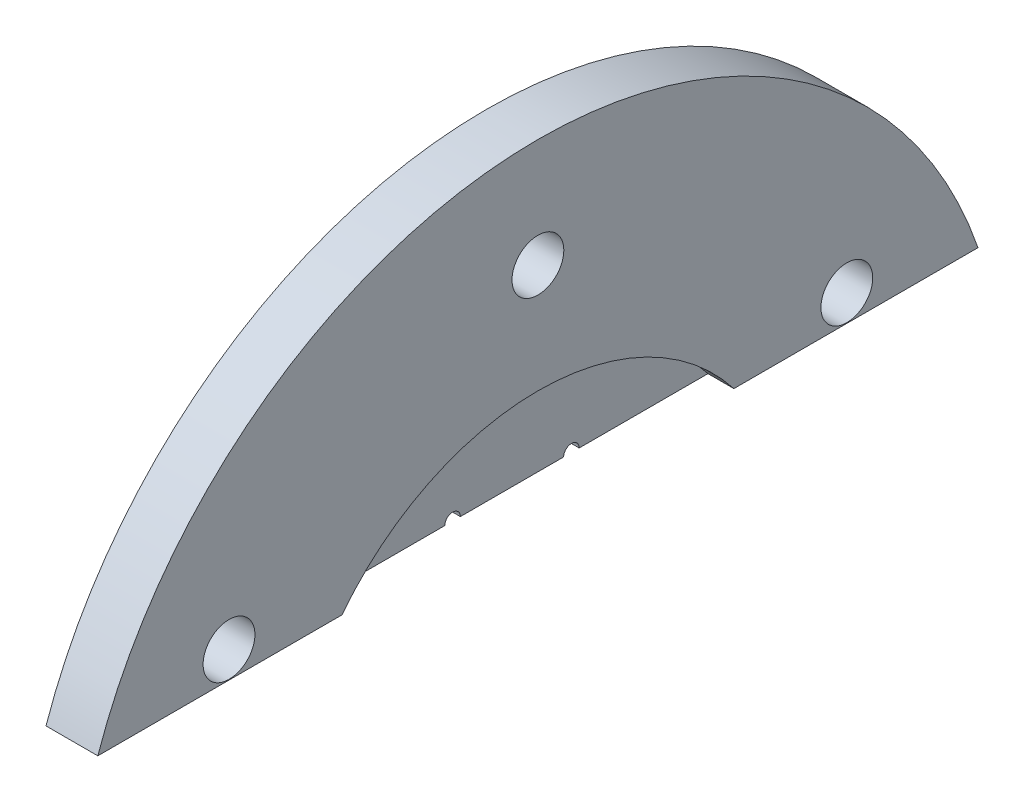
ISO-10303-21;
HEADER;
FILE_DESCRIPTION(('STEP AP214'),'2;1');
FILE_NAME('part.step','',(''),(''),'','','');
FILE_SCHEMA(('AUTOMOTIVE_DESIGN { 1 0 10303 214 1 1 1 1 }'));
ENDSEC;
DATA;
#1=APPLICATION_CONTEXT('core data for automotive mechanical design processes');
#2=APPLICATION_PROTOCOL_DEFINITION('international standard','automotive_design',2000,#1);
#3=PRODUCT_CONTEXT('',#1,'mechanical');
#4=PRODUCT('Part','Part','',(#3));
#5=PRODUCT_RELATED_PRODUCT_CATEGORY('part','',(#4));
#6=PRODUCT_DEFINITION_FORMATION('','',#4);
#7=PRODUCT_DEFINITION_CONTEXT('part definition',#1,'design');
#8=PRODUCT_DEFINITION('design','',#6,#7);
#9=PRODUCT_DEFINITION_SHAPE('','',#8);
#10=(LENGTH_UNIT() NAMED_UNIT(*) SI_UNIT(.MILLI.,.METRE.));
#11=(NAMED_UNIT(*) PLANE_ANGLE_UNIT() SI_UNIT($,.RADIAN.));
#12=(NAMED_UNIT(*) SI_UNIT($,.STERADIAN.) SOLID_ANGLE_UNIT());
#13=UNCERTAINTY_MEASURE_WITH_UNIT(LENGTH_MEASURE(1.E-05),#10,'distance_accuracy_value','');
#14=(GEOMETRIC_REPRESENTATION_CONTEXT(3) GLOBAL_UNCERTAINTY_ASSIGNED_CONTEXT((#13)) GLOBAL_UNIT_ASSIGNED_CONTEXT((#10,
#11,#12)) REPRESENTATION_CONTEXT('',''));
#15=CARTESIAN_POINT('',(0.,0.,0.));
#16=DIRECTION('',(0.,0.,1.));
#17=DIRECTION('',(1.,0.,0.));
#18=AXIS2_PLACEMENT_3D('',#15,#16,#17);
#19=CARTESIAN_POINT('',(-5.,0.,0.));
#20=DIRECTION('',(-1.,0.,0.));
#21=DIRECTION('',(0.,0.,1.));
#22=AXIS2_PLACEMENT_3D('',#19,#20,#21);
#23=PLANE('',#22);
#24=DIRECTION('',(0.,0.,1.));
#25=VECTOR('',#24,1.);
#26=CARTESIAN_POINT('',(-5.,29.2826,0.));
#27=LINE('',#26,#25);
#28=CARTESIAN_POINT('',(-5.,29.2826,-9.96410161513775));
#29=VERTEX_POINT('',#28);
#30=CARTESIAN_POINT('',(-5.,29.2826,-6.96410161513776));
#31=VERTEX_POINT('',#30);
#32=EDGE_CURVE('E302',#29,#31,#27,.T.);
#33=ORIENTED_EDGE('',*,*,#32,.T.);
#34=CARTESIAN_POINT('',(-5.,29.2826,-11.4641016151378));
#35=DIRECTION('',(-1.,0.,0.));
#36=DIRECTION('',(0.,0.,-1.));
#37=AXIS2_PLACEMENT_3D('',#34,#35,#36);
#38=CIRCLE('',#37,4.5);
#39=CARTESIAN_POINT('',(-5.,31.5326,-15.3612159321677));
#40=VERTEX_POINT('',#39);
#41=EDGE_CURVE('E190',#31,#40,#38,.T.);
#42=ORIENTED_EDGE('',*,*,#41,.T.);
#43=DIRECTION('',(0.,-0.866025403784439,-0.5));
#44=VECTOR('',#43,1.);
#45=CARTESIAN_POINT('',(-5.,-2.46309676972451,-34.9886406134571));
#46=LINE('',#45,#44);
#47=CARTESIAN_POINT('',(-5.,29.2826,-16.6602540378444));
#48=VERTEX_POINT('',#47);
#49=EDGE_CURVE('E193',#40,#48,#46,.T.);
#50=ORIENTED_EDGE('',*,*,#49,.T.);
#51=CARTESIAN_POINT('',(-5.,29.2826,-12.9641016151378));
#52=VERTEX_POINT('',#51);
#53=EDGE_CURVE('E161',#48,#52,#27,.T.);
#54=ORIENTED_EDGE('',*,*,#53,.T.);
#55=CARTESIAN_POINT('',(-5.,29.2826,-11.4641016151378));
#56=DIRECTION('',(-1.,0.,0.));
#57=DIRECTION('',(0.,0.,-1.));
#58=AXIS2_PLACEMENT_3D('',#55,#56,#57);
#59=CIRCLE('',#58,1.5);
#60=EDGE_CURVE('E213',#29,#52,#59,.T.);
#61=ORIENTED_EDGE('',*,*,#60,.F.);
#62=EDGE_LOOP('',(#33,#42,#50,#54,#61));
#63=FACE_BOUND('',#62,.T.);
#64=ADVANCED_FACE('F41',(#63),#23,.T.);
#65=CARTESIAN_POINT('',(10.,0.,0.));
#66=DIRECTION('',(-1.,0.,0.));
#67=DIRECTION('',(0.,0.,1.));
#68=AXIS2_PLACEMENT_3D('',#65,#66,#67);
#69=CYLINDRICAL_SURFACE('',#68,47.825);
#70=DIRECTION('',(-1.,0.,0.));
#71=VECTOR('',#70,1.);
#72=CARTESIAN_POINT('',(10.,29.2826,-37.8121668545985));
#73=LINE('',#72,#71);
#74=CARTESIAN_POINT('',(10.,29.2826,-37.8121668545985));
#75=VERTEX_POINT('',#74);
#76=CARTESIAN_POINT('',(5.,29.2826,-37.8121668545985));
#77=VERTEX_POINT('',#76);
#78=EDGE_CURVE('E325',#75,#77,#73,.T.);
#79=ORIENTED_EDGE('',*,*,#78,.F.);
#80=CARTESIAN_POINT('',(10.,0.,0.));
#81=DIRECTION('',(1.,0.,0.));
#82=DIRECTION('',(0.,0.,-1.));
#83=AXIS2_PLACEMENT_3D('',#80,#81,#82);
#84=CIRCLE('',#83,47.825);
#85=CARTESIAN_POINT('',(10.,29.2826,37.8121668545985));
#86=VERTEX_POINT('',#85);
#87=EDGE_CURVE('E223',#75,#86,#84,.T.);
#88=ORIENTED_EDGE('',*,*,#87,.T.);
#89=DIRECTION('',(-1.,0.,0.));
#90=VECTOR('',#89,1.);
#91=CARTESIAN_POINT('',(10.,29.2826,37.8121668545985));
#92=LINE('',#91,#90);
#93=CARTESIAN_POINT('',(5.,29.2826,37.8121668545985));
#94=VERTEX_POINT('',#93);
#95=EDGE_CURVE('E311',#94,#86,#92,.F.);
#96=ORIENTED_EDGE('',*,*,#95,.F.);
#97=CARTESIAN_POINT('',(5.,0.,0.));
#98=DIRECTION('',(-1.,0.,0.));
#99=DIRECTION('',(0.,0.,1.));
#100=AXIS2_PLACEMENT_3D('',#97,#98,#99);
#101=CIRCLE('',#100,47.825);
#102=EDGE_CURVE('E216',#94,#77,#101,.T.);
#103=ORIENTED_EDGE('',*,*,#102,.T.);
#104=EDGE_LOOP('',(#79,#88,#96,#103));
#105=FACE_BOUND('',#104,.T.);
#106=ADVANCED_FACE('F258',(#105),#69,.F.);
#107=CARTESIAN_POINT('',(10.,0.,0.));
#108=DIRECTION('',(1.,0.,0.));
#109=DIRECTION('',(0.,0.,-1.));
#110=AXIS2_PLACEMENT_3D('',#107,#108,#109);
#111=PLANE('',#110);
#112=DIRECTION('',(0.,0.,-1.));
#113=VECTOR('',#112,1.);
#114=CARTESIAN_POINT('',(10.,29.2826,0.));
#115=LINE('',#114,#113);
#116=CARTESIAN_POINT('',(10.,29.2826,-84.9179601865236));
#117=VERTEX_POINT('',#116);
#118=EDGE_CURVE('E350',#75,#117,#115,.T.);
#119=ORIENTED_EDGE('',*,*,#118,.T.);
#120=CARTESIAN_POINT('',(10.,0.,0.));
#121=DIRECTION('',(1.,0.,0.));
#122=DIRECTION('',(0.,0.,-1.));
#123=AXIS2_PLACEMENT_3D('',#120,#121,#122);
#124=CIRCLE('',#123,89.825);
#125=CARTESIAN_POINT('',(10.,29.2826,84.9179601865236));
#126=VERTEX_POINT('',#125);
#127=EDGE_CURVE('E227',#117,#126,#124,.T.);
#128=ORIENTED_EDGE('',*,*,#127,.T.);
#129=EDGE_CURVE('E349',#126,#86,#115,.T.);
#130=ORIENTED_EDGE('',*,*,#129,.T.);
#131=ORIENTED_EDGE('',*,*,#87,.F.);
#132=EDGE_LOOP('',(#119,#128,#130,#131));
#133=FACE_BOUND('',#132,.T.);
#134=CARTESIAN_POINT('',(10.,68.825,0.));
#135=DIRECTION('',(1.,0.,0.));
#136=DIRECTION('',(0.,0.,-1.));
#137=AXIS2_PLACEMENT_3D('',#134,#135,#136);
#138=CIRCLE('',#137,5.);
#139=CARTESIAN_POINT('',(10.,68.825,-5.));
#140=VERTEX_POINT('',#139);
#141=EDGE_CURVE('E234',#140,#140,#138,.T.);
#142=ORIENTED_EDGE('',*,*,#141,.F.);
#143=EDGE_LOOP('',(#142));
#144=FACE_BOUND('',#143,.T.);
#145=CARTESIAN_POINT('',(10.,34.4125,59.604198415464));
#146=DIRECTION('',(1.,0.,0.));
#147=DIRECTION('',(0.,0.,-1.));
#148=AXIS2_PLACEMENT_3D('',#145,#146,#147);
#149=CIRCLE('',#148,5.00000000000001);
#150=CARTESIAN_POINT('',(10.,34.4125,54.604198415464));
#151=VERTEX_POINT('',#150);
#152=EDGE_CURVE('E331',#151,#151,#149,.T.);
#153=ORIENTED_EDGE('',*,*,#152,.F.);
#154=EDGE_LOOP('',(#153));
#155=FACE_BOUND('',#154,.T.);
#156=CARTESIAN_POINT('',(10.,34.4125,-59.604198415464));
#157=DIRECTION('',(1.,0.,0.));
#158=DIRECTION('',(0.,0.,-1.));
#159=AXIS2_PLACEMENT_3D('',#156,#157,#158);
#160=CIRCLE('',#159,5.00000000000001);
#161=CARTESIAN_POINT('',(10.,34.4125,-64.604198415464));
#162=VERTEX_POINT('',#161);
#163=EDGE_CURVE('E334',#162,#162,#160,.T.);
#164=ORIENTED_EDGE('',*,*,#163,.F.);
#165=EDGE_LOOP('',(#164));
#166=FACE_BOUND('',#165,.T.);
#167=ADVANCED_FACE('F265',(#133,#144,#155,#166),#111,.T.);
#168=CARTESIAN_POINT('',(0.,0.,0.));
#169=DIRECTION('',(1.,0.,0.));
#170=DIRECTION('',(0.,0.,-1.));
#171=AXIS2_PLACEMENT_3D('',#168,#169,#170);
#172=PLANE('',#171);
#173=CARTESIAN_POINT('',(0.,68.825,0.));
#174=DIRECTION('',(1.,0.,0.));
#175=DIRECTION('',(0.,0.,-1.));
#176=AXIS2_PLACEMENT_3D('',#173,#174,#175);
#177=CIRCLE('',#176,5.);
#178=CARTESIAN_POINT('',(0.,68.825,-5.));
#179=VERTEX_POINT('',#178);
#180=EDGE_CURVE('E177',#179,#179,#177,.T.);
#181=ORIENTED_EDGE('',*,*,#180,.T.);
#182=EDGE_LOOP('',(#181));
#183=FACE_BOUND('',#182,.T.);
#184=CARTESIAN_POINT('',(0.,34.4125,59.604198415464));
#185=DIRECTION('',(1.,0.,0.));
#186=DIRECTION('',(0.,0.,-1.));
#187=AXIS2_PLACEMENT_3D('',#184,#185,#186);
#188=CIRCLE('',#187,5.00000000000001);
#189=CARTESIAN_POINT('',(0.,34.4125,54.604198415464));
#190=VERTEX_POINT('',#189);
#191=EDGE_CURVE('E183',#190,#190,#188,.T.);
#192=ORIENTED_EDGE('',*,*,#191,.T.);
#193=EDGE_LOOP('',(#192));
#194=FACE_BOUND('',#193,.T.);
#195=CARTESIAN_POINT('',(0.,34.4125,-59.604198415464));
#196=DIRECTION('',(1.,0.,0.));
#197=DIRECTION('',(0.,0.,-1.));
#198=AXIS2_PLACEMENT_3D('',#195,#196,#197);
#199=CIRCLE('',#198,5.00000000000001);
#200=CARTESIAN_POINT('',(0.,34.4125,-64.604198415464));
#201=VERTEX_POINT('',#200);
#202=EDGE_CURVE('E231',#201,#201,#199,.T.);
#203=ORIENTED_EDGE('',*,*,#202,.T.);
#204=EDGE_LOOP('',(#203));
#205=FACE_BOUND('',#204,.T.);
#206=CARTESIAN_POINT('',(0.,0.,0.));
#207=DIRECTION('',(1.,0.,0.));
#208=DIRECTION('',(0.,0.,-1.));
#209=AXIS2_PLACEMENT_3D('',#206,#207,#208);
#210=CIRCLE('',#209,89.825);
#211=CARTESIAN_POINT('',(0.,29.2826,-84.9179601865236));
#212=VERTEX_POINT('',#211);
#213=CARTESIAN_POINT('',(0.,29.2826,84.9179601865236));
#214=VERTEX_POINT('',#213);
#215=EDGE_CURVE('E226',#212,#214,#210,.T.);
#216=ORIENTED_EDGE('',*,*,#215,.F.);
#217=DIRECTION('',(0.,0.,1.));
#218=VECTOR('',#217,1.);
#219=CARTESIAN_POINT('',(0.,29.2826,0.));
#220=LINE('',#219,#218);
#221=CARTESIAN_POINT('',(0.,29.2826,-42.1519271474034));
#222=VERTEX_POINT('',#221);
#223=EDGE_CURVE('E163',#212,#222,#220,.T.);
#224=ORIENTED_EDGE('',*,*,#223,.T.);
#225=CARTESIAN_POINT('',(0.,0.,0.));
#226=DIRECTION('',(-1.,0.,0.));
#227=DIRECTION('',(0.,0.,1.));
#228=AXIS2_PLACEMENT_3D('',#225,#226,#227);
#229=CIRCLE('',#228,51.325);
#230=CARTESIAN_POINT('',(0.,29.2826,42.1519271474034));
#231=VERTEX_POINT('',#230);
#232=EDGE_CURVE('E169',#231,#222,#229,.T.);
#233=ORIENTED_EDGE('',*,*,#232,.F.);
#234=EDGE_CURVE('E152',#231,#214,#220,.T.);
#235=ORIENTED_EDGE('',*,*,#234,.T.);
#236=EDGE_LOOP('',(#216,#224,#233,#235));
#237=FACE_BOUND('',#236,.T.);
#238=ADVANCED_FACE('F175',(#183,#194,#205,#237),#172,.F.);
#239=CARTESIAN_POINT('',(10.,0.,0.));
#240=DIRECTION('',(-1.,0.,0.));
#241=DIRECTION('',(0.,0.,1.));
#242=AXIS2_PLACEMENT_3D('',#239,#240,#241);
#243=CYLINDRICAL_SURFACE('',#242,89.825);
#244=ORIENTED_EDGE('',*,*,#127,.F.);
#245=DIRECTION('',(-1.,0.,0.));
#246=VECTOR('',#245,1.);
#247=CARTESIAN_POINT('',(10.,29.2826,-84.9179601865236));
#248=LINE('',#247,#246);
#249=EDGE_CURVE('E328',#117,#212,#248,.T.);
#250=ORIENTED_EDGE('',*,*,#249,.T.);
#251=ORIENTED_EDGE('',*,*,#215,.T.);
#252=DIRECTION('',(-1.,0.,0.));
#253=VECTOR('',#252,1.);
#254=CARTESIAN_POINT('',(10.,29.2826,84.9179601865236));
#255=LINE('',#254,#253);
#256=EDGE_CURVE('E155',#214,#126,#255,.F.);
#257=ORIENTED_EDGE('',*,*,#256,.T.);
#258=EDGE_LOOP('',(#244,#250,#251,#257));
#259=FACE_BOUND('',#258,.T.);
#260=ADVANCED_FACE('F43',(#259),#243,.T.);
#261=CARTESIAN_POINT('',(5.,0.,0.));
#262=DIRECTION('',(-1.,0.,0.));
#263=DIRECTION('',(0.,0.,1.));
#264=AXIS2_PLACEMENT_3D('',#261,#262,#263);
#265=PLANE('',#264);
#266=ORIENTED_EDGE('',*,*,#102,.F.);
#267=DIRECTION('',(0.,0.,-1.));
#268=VECTOR('',#267,1.);
#269=CARTESIAN_POINT('',(5.,29.2826,0.));
#270=LINE('',#269,#268);
#271=CARTESIAN_POINT('',(5.,29.2826,12.9641016151378));
#272=VERTEX_POINT('',#271);
#273=EDGE_CURVE('E309',#94,#272,#270,.T.);
#274=ORIENTED_EDGE('',*,*,#273,.T.);
#275=CARTESIAN_POINT('',(5.,29.2826,11.4641016151378));
#276=DIRECTION('',(-1.,0.,0.));
#277=DIRECTION('',(0.,0.,1.));
#278=AXIS2_PLACEMENT_3D('',#275,#276,#277);
#279=CIRCLE('',#278,1.5);
#280=CARTESIAN_POINT('',(5.,29.2826,9.96410161513775));
#281=VERTEX_POINT('',#280);
#282=EDGE_CURVE('E212',#281,#272,#279,.F.);
#283=ORIENTED_EDGE('',*,*,#282,.F.);
#284=CARTESIAN_POINT('',(5.,29.2826,-9.96410161513775));
#285=VERTEX_POINT('',#284);
#286=EDGE_CURVE('E314',#281,#285,#270,.T.);
#287=ORIENTED_EDGE('',*,*,#286,.T.);
#288=CARTESIAN_POINT('',(5.,29.2826,-11.4641016151378));
#289=DIRECTION('',(-1.,0.,0.));
#290=DIRECTION('',(0.,0.,1.));
#291=AXIS2_PLACEMENT_3D('',#288,#289,#290);
#292=CIRCLE('',#291,1.5);
#293=CARTESIAN_POINT('',(5.,29.2826,-12.9641016151378));
#294=VERTEX_POINT('',#293);
#295=EDGE_CURVE('E202',#294,#285,#292,.F.);
#296=ORIENTED_EDGE('',*,*,#295,.F.);
#297=EDGE_CURVE('E313',#294,#77,#270,.T.);
#298=ORIENTED_EDGE('',*,*,#297,.T.);
#299=EDGE_LOOP('',(#266,#274,#283,#287,#296,#298));
#300=FACE_BOUND('',#299,.T.);
#301=ADVANCED_FACE('F273',(#300),#265,.F.);
#302=CARTESIAN_POINT('',(-5.,29.2826,12.9641016151378));
#303=VERTEX_POINT('',#302);
#304=CARTESIAN_POINT('',(-5.,29.2826,16.6602540378444));
#305=VERTEX_POINT('',#304);
#306=EDGE_CURVE('E284',#303,#305,#27,.T.);
#307=ORIENTED_EDGE('',*,*,#306,.T.);
#308=DIRECTION('',(0.,0.866025403784438,-0.5));
#309=VECTOR('',#308,1.);
#310=CARTESIAN_POINT('',(-5.,31.5326,15.3612159321677));
#311=LINE('',#310,#309);
#312=CARTESIAN_POINT('',(-5.,31.5326,15.3612159321677));
#313=VERTEX_POINT('',#312);
#314=EDGE_CURVE('E196',#305,#313,#311,.T.);
#315=ORIENTED_EDGE('',*,*,#314,.T.);
#316=CARTESIAN_POINT('',(-5.,29.2826,11.4641016151378));
#317=DIRECTION('',(-1.,0.,0.));
#318=DIRECTION('',(0.,0.,-1.));
#319=AXIS2_PLACEMENT_3D('',#316,#317,#318);
#320=CIRCLE('',#319,4.5);
#321=CARTESIAN_POINT('',(-5.,29.2826,6.96410161513775));
#322=VERTEX_POINT('',#321);
#323=EDGE_CURVE('E187',#313,#322,#320,.T.);
#324=ORIENTED_EDGE('',*,*,#323,.T.);
#325=CARTESIAN_POINT('',(-5.,29.2826,9.96410161513775));
#326=VERTEX_POINT('',#325);
#327=EDGE_CURVE('E288',#322,#326,#27,.T.);
#328=ORIENTED_EDGE('',*,*,#327,.T.);
#329=CARTESIAN_POINT('',(-5.,29.2826,11.4641016151378));
#330=DIRECTION('',(-1.,0.,0.));
#331=DIRECTION('',(0.,0.,1.));
#332=AXIS2_PLACEMENT_3D('',#329,#330,#331);
#333=CIRCLE('',#332,1.5);
#334=EDGE_CURVE('E209',#303,#326,#333,.T.);
#335=ORIENTED_EDGE('',*,*,#334,.F.);
#336=EDGE_LOOP('',(#307,#315,#324,#328,#335));
#337=FACE_BOUND('',#336,.T.);
#338=ADVANCED_FACE('F261',(#337),#23,.T.);
#339=CARTESIAN_POINT('',(10.001,29.2826,-11.4641016151378));
#340=DIRECTION('',(-1.,0.,0.));
#341=DIRECTION('',(0.,0.,1.));
#342=AXIS2_PLACEMENT_3D('',#339,#340,#341);
#343=CYLINDRICAL_SURFACE('',#342,1.5);
#344=ORIENTED_EDGE('',*,*,#60,.T.);
#345=DIRECTION('',(-1.,0.,0.));
#346=VECTOR('',#345,1.);
#347=CARTESIAN_POINT('',(10.001,29.2826,-12.9641016151378));
#348=LINE('',#347,#346);
#349=EDGE_CURVE('E322',#52,#294,#348,.F.);
#350=ORIENTED_EDGE('',*,*,#349,.T.);
#351=ORIENTED_EDGE('',*,*,#295,.T.);
#352=DIRECTION('',(-1.,0.,0.));
#353=VECTOR('',#352,1.);
#354=CARTESIAN_POINT('',(10.001,29.2826,-9.96410161513775));
#355=LINE('',#354,#353);
#356=EDGE_CURVE('E319',#285,#29,#355,.T.);
#357=ORIENTED_EDGE('',*,*,#356,.T.);
#358=EDGE_LOOP('',(#344,#350,#351,#357));
#359=FACE_BOUND('',#358,.T.);
#360=ADVANCED_FACE('F272',(#359),#343,.F.);
#361=CARTESIAN_POINT('',(10.001,29.2826,11.4641016151378));
#362=DIRECTION('',(-1.,0.,0.));
#363=DIRECTION('',(0.,0.,1.));
#364=AXIS2_PLACEMENT_3D('',#361,#362,#363);
#365=CYLINDRICAL_SURFACE('',#364,1.5);
#366=ORIENTED_EDGE('',*,*,#334,.T.);
#367=DIRECTION('',(-1.,0.,0.));
#368=VECTOR('',#367,1.);
#369=CARTESIAN_POINT('',(10.001,29.2826,9.96410161513775));
#370=LINE('',#369,#368);
#371=EDGE_CURVE('E305',#326,#281,#370,.F.);
#372=ORIENTED_EDGE('',*,*,#371,.T.);
#373=ORIENTED_EDGE('',*,*,#282,.T.);
#374=DIRECTION('',(-1.,0.,0.));
#375=VECTOR('',#374,1.);
#376=CARTESIAN_POINT('',(10.001,29.2826,12.9641016151378));
#377=LINE('',#376,#375);
#378=EDGE_CURVE('E307',#272,#303,#377,.T.);
#379=ORIENTED_EDGE('',*,*,#378,.T.);
#380=EDGE_LOOP('',(#366,#372,#373,#379));
#381=FACE_BOUND('',#380,.T.);
#382=ADVANCED_FACE('F279',(#381),#365,.F.);
#383=CARTESIAN_POINT('',(0.,29.2826,11.4641016151378));
#384=DIRECTION('',(-1.,0.,0.));
#385=DIRECTION('',(0.,0.,1.));
#386=AXIS2_PLACEMENT_3D('',#383,#384,#385);
#387=CYLINDRICAL_SURFACE('',#386,4.5);
#388=ORIENTED_EDGE('',*,*,#323,.F.);
#389=DIRECTION('',(-1.,0.,0.));
#390=VECTOR('',#389,1.);
#391=CARTESIAN_POINT('',(0.,31.5326,15.3612159321677));
#392=LINE('',#391,#390);
#393=CARTESIAN_POINT('',(2.,31.5326,15.3612159321677));
#394=VERTEX_POINT('',#393);
#395=EDGE_CURVE('E199',#394,#313,#392,.T.);
#396=ORIENTED_EDGE('',*,*,#395,.F.);
#397=CARTESIAN_POINT('',(2.,29.2826,11.4641016151378));
#398=DIRECTION('',(-1.,0.,0.));
#399=DIRECTION('',(0.,0.,1.));
#400=AXIS2_PLACEMENT_3D('',#397,#398,#399);
#401=CIRCLE('',#400,4.5);
#402=CARTESIAN_POINT('',(2.,29.2826,6.96410161513775));
#403=VERTEX_POINT('',#402);
#404=EDGE_CURVE('E180',#403,#394,#401,.F.);
#405=ORIENTED_EDGE('',*,*,#404,.F.);
#406=DIRECTION('',(-1.,0.,0.));
#407=VECTOR('',#406,1.);
#408=CARTESIAN_POINT('',(0.,29.2826,6.96410161513776));
#409=LINE('',#408,#407);
#410=EDGE_CURVE('E198',#403,#322,#409,.T.);
#411=ORIENTED_EDGE('',*,*,#410,.T.);
#412=EDGE_LOOP('',(#388,#396,#405,#411));
#413=FACE_BOUND('',#412,.T.);
#414=ADVANCED_FACE('F300',(#413),#387,.T.);
#415=CARTESIAN_POINT('',(0.,31.5326,15.3612159321677));
#416=DIRECTION('',(0.,0.5,0.866025403784439));
#417=DIRECTION('',(0.,-0.866025403784439,0.5));
#418=AXIS2_PLACEMENT_3D('',#415,#416,#417);
#419=PLANE('',#418);
#420=DIRECTION('',(-1.,0.,0.));
#421=VECTOR('',#420,1.);
#422=CARTESIAN_POINT('',(0.,29.2826,16.6602540378444));
#423=LINE('',#422,#421);
#424=CARTESIAN_POINT('',(2.,29.2826,16.6602540378444));
#425=VERTEX_POINT('',#424);
#426=EDGE_CURVE('E172',#425,#305,#423,.T.);
#427=ORIENTED_EDGE('',*,*,#426,.F.);
#428=DIRECTION('',(0.,-0.866025403784439,0.5));
#429=VECTOR('',#428,1.);
#430=CARTESIAN_POINT('',(2.,14.5347516151378,25.1749282728124));
#431=LINE('',#430,#429);
#432=EDGE_CURVE('E296',#394,#425,#431,.T.);
#433=ORIENTED_EDGE('',*,*,#432,.F.);
#434=ORIENTED_EDGE('',*,*,#395,.T.);
#435=ORIENTED_EDGE('',*,*,#314,.F.);
#436=EDGE_LOOP('',(#427,#433,#434,#435));
#437=FACE_BOUND('',#436,.T.);
#438=ADVANCED_FACE('F292',(#437),#419,.T.);
#439=CARTESIAN_POINT('',(0.,-2.46309676972451,-34.9886406134571));
#440=DIRECTION('',(0.,0.5,-0.866025403784439));
#441=DIRECTION('',(0.,0.866025403784439,0.5));
#442=AXIS2_PLACEMENT_3D('',#439,#440,#441);
#443=PLANE('',#442);
#444=DIRECTION('',(1.,0.,0.));
#445=VECTOR('',#444,1.);
#446=CARTESIAN_POINT('',(0.,29.2826,-16.6602540378444));
#447=LINE('',#446,#445);
#448=CARTESIAN_POINT('',(2.,29.2826,-16.6602540378444));
#449=VERTEX_POINT('',#448);
#450=EDGE_CURVE('E64',#48,#449,#447,.T.);
#451=ORIENTED_EDGE('',*,*,#450,.F.);
#452=ORIENTED_EDGE('',*,*,#49,.F.);
#453=DIRECTION('',(-1.,0.,0.));
#454=VECTOR('',#453,1.);
#455=CARTESIAN_POINT('',(0.,31.5326,-15.3612159321677));
#456=LINE('',#455,#454);
#457=CARTESIAN_POINT('',(2.,31.5326,-15.3612159321677));
#458=VERTEX_POINT('',#457);
#459=EDGE_CURVE('E203',#458,#40,#456,.T.);
#460=ORIENTED_EDGE('',*,*,#459,.F.);
#461=DIRECTION('',(0.,0.866025403784439,0.5));
#462=VECTOR('',#461,1.);
#463=CARTESIAN_POINT('',(2.,14.5347516151377,-25.1749282728124));
#464=LINE('',#463,#462);
#465=EDGE_CURVE('E339',#449,#458,#464,.T.);
#466=ORIENTED_EDGE('',*,*,#465,.F.);
#467=EDGE_LOOP('',(#451,#452,#460,#466));
#468=FACE_BOUND('',#467,.T.);
#469=ADVANCED_FACE('F370',(#468),#443,.T.);
#470=CARTESIAN_POINT('',(0.,29.2826,-11.4641016151378));
#471=DIRECTION('',(-1.,0.,0.));
#472=DIRECTION('',(0.,0.,1.));
#473=AXIS2_PLACEMENT_3D('',#470,#471,#472);
#474=CYLINDRICAL_SURFACE('',#473,4.5);
#475=ORIENTED_EDGE('',*,*,#41,.F.);
#476=DIRECTION('',(-1.,0.,0.));
#477=VECTOR('',#476,1.);
#478=CARTESIAN_POINT('',(0.,29.2826,-6.96410161513776));
#479=LINE('',#478,#477);
#480=CARTESIAN_POINT('',(2.,29.2826,-6.96410161513776));
#481=VERTEX_POINT('',#480);
#482=EDGE_CURVE('E205',#481,#31,#479,.T.);
#483=ORIENTED_EDGE('',*,*,#482,.F.);
#484=CARTESIAN_POINT('',(2.,29.2826,-11.4641016151378));
#485=DIRECTION('',(-1.,0.,0.));
#486=DIRECTION('',(0.,0.,1.));
#487=AXIS2_PLACEMENT_3D('',#484,#485,#486);
#488=CIRCLE('',#487,4.5);
#489=EDGE_CURVE('E176',#458,#481,#488,.F.);
#490=ORIENTED_EDGE('',*,*,#489,.F.);
#491=ORIENTED_EDGE('',*,*,#459,.T.);
#492=EDGE_LOOP('',(#475,#483,#490,#491));
#493=FACE_BOUND('',#492,.T.);
#494=ADVANCED_FACE('F368',(#493),#474,.T.);
#495=CARTESIAN_POINT('',(2.,0.,0.));
#496=DIRECTION('',(-1.,0.,0.));
#497=DIRECTION('',(0.,0.,1.));
#498=AXIS2_PLACEMENT_3D('',#495,#496,#497);
#499=CYLINDRICAL_SURFACE('',#498,51.325);
#500=ORIENTED_EDGE('',*,*,#232,.T.);
#501=DIRECTION('',(-1.,0.,0.));
#502=VECTOR('',#501,1.);
#503=CARTESIAN_POINT('',(2.,29.2826,-42.1519271474034));
#504=LINE('',#503,#502);
#505=CARTESIAN_POINT('',(2.,29.2826,-42.1519271474034));
#506=VERTEX_POINT('',#505);
#507=EDGE_CURVE('E160',#222,#506,#504,.F.);
#508=ORIENTED_EDGE('',*,*,#507,.T.);
#509=CARTESIAN_POINT('',(2.,0.,0.));
#510=DIRECTION('',(-1.,0.,0.));
#511=DIRECTION('',(0.,0.,1.));
#512=AXIS2_PLACEMENT_3D('',#509,#510,#511);
#513=CIRCLE('',#512,51.325);
#514=CARTESIAN_POINT('',(2.,29.2826,42.1519271474034));
#515=VERTEX_POINT('',#514);
#516=EDGE_CURVE('E171',#515,#506,#513,.T.);
#517=ORIENTED_EDGE('',*,*,#516,.F.);
#518=DIRECTION('',(-1.,0.,0.));
#519=VECTOR('',#518,1.);
#520=CARTESIAN_POINT('',(2.,29.2826,42.1519271474034));
#521=LINE('',#520,#519);
#522=EDGE_CURVE('E56',#515,#231,#521,.T.);
#523=ORIENTED_EDGE('',*,*,#522,.T.);
#524=EDGE_LOOP('',(#500,#508,#517,#523));
#525=FACE_BOUND('',#524,.T.);
#526=ADVANCED_FACE('F167',(#525),#499,.F.);
#527=CARTESIAN_POINT('',(2.,0.,0.));
#528=DIRECTION('',(-1.,0.,0.));
#529=DIRECTION('',(0.,0.,1.));
#530=AXIS2_PLACEMENT_3D('',#527,#528,#529);
#531=PLANE('',#530);
#532=DIRECTION('',(0.,0.,-1.));
#533=VECTOR('',#532,1.);
#534=CARTESIAN_POINT('',(2.,29.2826,0.));
#535=LINE('',#534,#533);
#536=EDGE_CURVE('E11',#515,#425,#535,.T.);
#537=ORIENTED_EDGE('',*,*,#536,.F.);
#538=ORIENTED_EDGE('',*,*,#516,.T.);
#539=EDGE_CURVE('E45',#449,#506,#535,.T.);
#540=ORIENTED_EDGE('',*,*,#539,.F.);
#541=ORIENTED_EDGE('',*,*,#465,.T.);
#542=ORIENTED_EDGE('',*,*,#489,.T.);
#543=EDGE_CURVE('E50',#403,#481,#535,.T.);
#544=ORIENTED_EDGE('',*,*,#543,.F.);
#545=ORIENTED_EDGE('',*,*,#404,.T.);
#546=ORIENTED_EDGE('',*,*,#432,.T.);
#547=EDGE_LOOP('',(#537,#538,#540,#541,#542,#544,#545,#546));
#548=FACE_BOUND('',#547,.T.);
#549=ADVANCED_FACE('F253',(#548),#531,.T.);
#550=CARTESIAN_POINT('',(-5.,34.4125,-59.604198415464));
#551=DIRECTION('',(1.,0.,0.));
#552=DIRECTION('',(0.,0.,-1.));
#553=AXIS2_PLACEMENT_3D('',#550,#551,#552);
#554=CYLINDRICAL_SURFACE('',#553,5.00000000000001);
#555=ORIENTED_EDGE('',*,*,#163,.T.);
#556=EDGE_LOOP('',(#555));
#557=FACE_BOUND('',#556,.T.);
#558=ORIENTED_EDGE('',*,*,#202,.F.);
#559=EDGE_LOOP('',(#558));
#560=FACE_BOUND('',#559,.T.);
#561=ADVANCED_FACE('F243',(#557,#560),#554,.F.);
#562=CARTESIAN_POINT('',(-5.,34.4125,59.604198415464));
#563=DIRECTION('',(1.,0.,0.));
#564=DIRECTION('',(0.,0.,-1.));
#565=AXIS2_PLACEMENT_3D('',#562,#563,#564);
#566=CYLINDRICAL_SURFACE('',#565,5.00000000000001);
#567=ORIENTED_EDGE('',*,*,#152,.T.);
#568=EDGE_LOOP('',(#567));
#569=FACE_BOUND('',#568,.T.);
#570=ORIENTED_EDGE('',*,*,#191,.F.);
#571=EDGE_LOOP('',(#570));
#572=FACE_BOUND('',#571,.T.);
#573=ADVANCED_FACE('F240',(#569,#572),#566,.F.);
#574=CARTESIAN_POINT('',(-5.,68.825,0.));
#575=DIRECTION('',(1.,0.,0.));
#576=DIRECTION('',(0.,0.,-1.));
#577=AXIS2_PLACEMENT_3D('',#574,#575,#576);
#578=CYLINDRICAL_SURFACE('',#577,5.);
#579=ORIENTED_EDGE('',*,*,#141,.T.);
#580=EDGE_LOOP('',(#579));
#581=FACE_BOUND('',#580,.T.);
#582=ORIENTED_EDGE('',*,*,#180,.F.);
#583=EDGE_LOOP('',(#582));
#584=FACE_BOUND('',#583,.T.);
#585=ADVANCED_FACE('F242',(#581,#584),#578,.F.);
#586=CARTESIAN_POINT('',(0.,29.2826,0.));
#587=DIRECTION('',(0.,1.,0.));
#588=DIRECTION('',(0.,0.,1.));
#589=AXIS2_PLACEMENT_3D('',#586,#587,#588);
#590=PLANE('',#589);
#591=ORIENTED_EDGE('',*,*,#118,.F.);
#592=ORIENTED_EDGE('',*,*,#78,.T.);
#593=ORIENTED_EDGE('',*,*,#297,.F.);
#594=ORIENTED_EDGE('',*,*,#349,.F.);
#595=ORIENTED_EDGE('',*,*,#53,.F.);
#596=ORIENTED_EDGE('',*,*,#450,.T.);
#597=ORIENTED_EDGE('',*,*,#539,.T.);
#598=ORIENTED_EDGE('',*,*,#507,.F.);
#599=ORIENTED_EDGE('',*,*,#223,.F.);
#600=ORIENTED_EDGE('',*,*,#249,.F.);
#601=EDGE_LOOP('',(#591,#592,#593,#594,#595,#596,#597,#598,#599,#600));
#602=FACE_BOUND('',#601,.T.);
#603=ADVANCED_FACE('F250',(#602),#590,.F.);
#604=ORIENTED_EDGE('',*,*,#286,.F.);
#605=ORIENTED_EDGE('',*,*,#371,.F.);
#606=ORIENTED_EDGE('',*,*,#327,.F.);
#607=ORIENTED_EDGE('',*,*,#410,.F.);
#608=ORIENTED_EDGE('',*,*,#543,.T.);
#609=ORIENTED_EDGE('',*,*,#482,.T.);
#610=ORIENTED_EDGE('',*,*,#32,.F.);
#611=ORIENTED_EDGE('',*,*,#356,.F.);
#612=EDGE_LOOP('',(#604,#605,#606,#607,#608,#609,#610,#611));
#613=FACE_BOUND('',#612,.T.);
#614=ADVANCED_FACE('F466',(#613),#590,.F.);
#615=ORIENTED_EDGE('',*,*,#234,.F.);
#616=ORIENTED_EDGE('',*,*,#522,.F.);
#617=ORIENTED_EDGE('',*,*,#536,.T.);
#618=ORIENTED_EDGE('',*,*,#426,.T.);
#619=ORIENTED_EDGE('',*,*,#306,.F.);
#620=ORIENTED_EDGE('',*,*,#378,.F.);
#621=ORIENTED_EDGE('',*,*,#273,.F.);
#622=ORIENTED_EDGE('',*,*,#95,.T.);
#623=ORIENTED_EDGE('',*,*,#129,.F.);
#624=ORIENTED_EDGE('',*,*,#256,.F.);
#625=EDGE_LOOP('',(#615,#616,#617,#618,#619,#620,#621,#622,#623,#624));
#626=FACE_BOUND('',#625,.T.);
#627=ADVANCED_FACE('F153',(#626),#590,.F.);
#628=CLOSED_SHELL('',(#64,#106,#167,#238,#260,#301,#338,#360,#382,#414,#438,#469,#494,#526,#549,
#561,#573,#585,#603,#614,#627));
#629=MANIFOLD_SOLID_BREP('B2',#628);
#630=ADVANCED_BREP_SHAPE_REPRESENTATION('',(#18,#629),#14);
#631=SHAPE_DEFINITION_REPRESENTATION(#9,#630);
ENDSEC;
END-ISO-10303-21;
